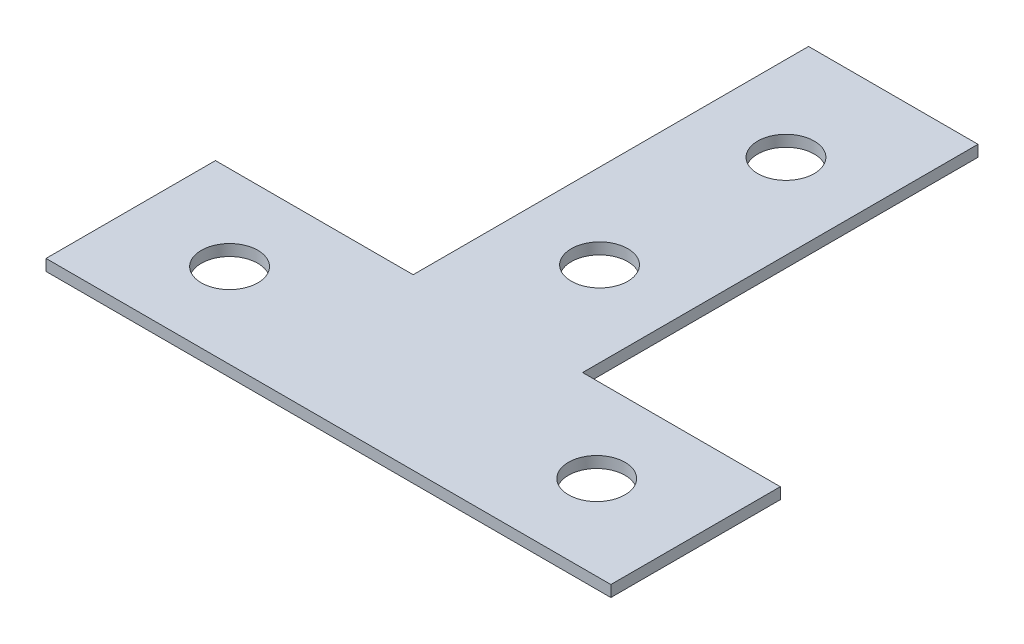
ISO-10303-21;
HEADER;
FILE_DESCRIPTION(('STEP AP214'),'2;1');
FILE_NAME('part.step','',(''),(''),'','','');
FILE_SCHEMA(('AUTOMOTIVE_DESIGN { 1 0 10303 214 1 1 1 1 }'));
ENDSEC;
DATA;
#1=APPLICATION_CONTEXT('core data for automotive mechanical design processes');
#2=APPLICATION_PROTOCOL_DEFINITION('international standard','automotive_design',2000,#1);
#3=PRODUCT_CONTEXT('',#1,'mechanical');
#4=PRODUCT('Part','Part','',(#3));
#5=PRODUCT_RELATED_PRODUCT_CATEGORY('part','',(#4));
#6=PRODUCT_DEFINITION_FORMATION('','',#4);
#7=PRODUCT_DEFINITION_CONTEXT('part definition',#1,'design');
#8=PRODUCT_DEFINITION('design','',#6,#7);
#9=PRODUCT_DEFINITION_SHAPE('','',#8);
#10=(LENGTH_UNIT() NAMED_UNIT(*) SI_UNIT(.MILLI.,.METRE.));
#11=(NAMED_UNIT(*) PLANE_ANGLE_UNIT() SI_UNIT($,.RADIAN.));
#12=(NAMED_UNIT(*) SI_UNIT($,.STERADIAN.) SOLID_ANGLE_UNIT());
#13=UNCERTAINTY_MEASURE_WITH_UNIT(LENGTH_MEASURE(1.E-05),#10,'distance_accuracy_value','');
#14=(GEOMETRIC_REPRESENTATION_CONTEXT(3) GLOBAL_UNCERTAINTY_ASSIGNED_CONTEXT((#13)) GLOBAL_UNIT_ASSIGNED_CONTEXT((#10,
#11,#12)) REPRESENTATION_CONTEXT('',''));
#15=CARTESIAN_POINT('',(0.,0.,0.));
#16=DIRECTION('',(0.,0.,1.));
#17=DIRECTION('',(1.,0.,0.));
#18=AXIS2_PLACEMENT_3D('',#15,#16,#17);
#19=CARTESIAN_POINT('',(32.5,1.,-15.));
#20=DIRECTION('',(0.,0.,1.));
#21=DIRECTION('',(1.,0.,0.));
#22=AXIS2_PLACEMENT_3D('',#19,#20,#21);
#23=PLANE('',#22);
#24=DIRECTION('',(-1.,0.,0.));
#25=VECTOR('',#24,1.);
#26=CARTESIAN_POINT('',(32.5,0.,-15.));
#27=LINE('',#26,#25);
#28=CARTESIAN_POINT('',(50.,0.,-15.));
#29=VERTEX_POINT('',#28);
#30=CARTESIAN_POINT('',(32.5,0.,-15.));
#31=VERTEX_POINT('',#30);
#32=EDGE_CURVE('E140',#29,#31,#27,.T.);
#33=ORIENTED_EDGE('',*,*,#32,.T.);
#34=DIRECTION('',(0.,-1.,0.));
#35=VECTOR('',#34,1.);
#36=CARTESIAN_POINT('',(32.5,1.,-15.));
#37=LINE('',#36,#35);
#38=CARTESIAN_POINT('',(32.5,1.,-15.));
#39=VERTEX_POINT('',#38);
#40=EDGE_CURVE('E11',#39,#31,#37,.T.);
#41=ORIENTED_EDGE('',*,*,#40,.F.);
#42=DIRECTION('',(-1.,0.,0.));
#43=VECTOR('',#42,1.);
#44=CARTESIAN_POINT('',(32.5,1.,-15.));
#45=LINE('',#44,#43);
#46=CARTESIAN_POINT('',(50.,1.,-15.));
#47=VERTEX_POINT('',#46);
#48=EDGE_CURVE('E163',#47,#39,#45,.T.);
#49=ORIENTED_EDGE('',*,*,#48,.F.);
#50=DIRECTION('',(0.,-1.,0.));
#51=VECTOR('',#50,1.);
#52=CARTESIAN_POINT('',(50.,1.,-15.));
#53=LINE('',#52,#51);
#54=EDGE_CURVE('E136',#47,#29,#53,.T.);
#55=ORIENTED_EDGE('',*,*,#54,.T.);
#56=EDGE_LOOP('',(#33,#41,#49,#55));
#57=FACE_BOUND('',#56,.T.);
#58=ADVANCED_FACE('F39',(#57),#23,.F.);
#59=CARTESIAN_POINT('',(32.5,1.,-50.));
#60=DIRECTION('',(-1.,0.,0.));
#61=DIRECTION('',(0.,0.,1.));
#62=AXIS2_PLACEMENT_3D('',#59,#60,#61);
#63=PLANE('',#62);
#64=DIRECTION('',(0.,0.,-1.));
#65=VECTOR('',#64,1.);
#66=CARTESIAN_POINT('',(32.5,0.,-50.));
#67=LINE('',#66,#65);
#68=CARTESIAN_POINT('',(32.5,0.,-50.));
#69=VERTEX_POINT('',#68);
#70=EDGE_CURVE('E144',#31,#69,#67,.T.);
#71=ORIENTED_EDGE('',*,*,#70,.T.);
#72=DIRECTION('',(0.,-1.,0.));
#73=VECTOR('',#72,1.);
#74=CARTESIAN_POINT('',(32.5,1.,-50.));
#75=LINE('',#74,#73);
#76=CARTESIAN_POINT('',(32.5,1.,-50.));
#77=VERTEX_POINT('',#76);
#78=EDGE_CURVE('E48',#77,#69,#75,.T.);
#79=ORIENTED_EDGE('',*,*,#78,.F.);
#80=DIRECTION('',(0.,0.,-1.));
#81=VECTOR('',#80,1.);
#82=CARTESIAN_POINT('',(32.5,1.,-50.));
#83=LINE('',#82,#81);
#84=EDGE_CURVE('E99',#39,#77,#83,.T.);
#85=ORIENTED_EDGE('',*,*,#84,.F.);
#86=ORIENTED_EDGE('',*,*,#40,.T.);
#87=EDGE_LOOP('',(#71,#79,#85,#86));
#88=FACE_BOUND('',#87,.T.);
#89=ADVANCED_FACE('F272',(#88),#63,.F.);
#90=CARTESIAN_POINT('',(17.5,1.,-50.));
#91=DIRECTION('',(0.,0.,1.));
#92=DIRECTION('',(1.,0.,0.));
#93=AXIS2_PLACEMENT_3D('',#90,#91,#92);
#94=PLANE('',#93);
#95=DIRECTION('',(-1.,0.,0.));
#96=VECTOR('',#95,1.);
#97=CARTESIAN_POINT('',(17.5,0.,-50.));
#98=LINE('',#97,#96);
#99=CARTESIAN_POINT('',(17.5,0.,-50.));
#100=VERTEX_POINT('',#99);
#101=EDGE_CURVE('E148',#69,#100,#98,.T.);
#102=ORIENTED_EDGE('',*,*,#101,.T.);
#103=DIRECTION('',(0.,-1.,0.));
#104=VECTOR('',#103,1.);
#105=CARTESIAN_POINT('',(17.5,1.,-50.));
#106=LINE('',#105,#104);
#107=CARTESIAN_POINT('',(17.5,1.,-50.));
#108=VERTEX_POINT('',#107);
#109=EDGE_CURVE('E174',#108,#100,#106,.T.);
#110=ORIENTED_EDGE('',*,*,#109,.F.);
#111=DIRECTION('',(-1.,0.,0.));
#112=VECTOR('',#111,1.);
#113=CARTESIAN_POINT('',(17.5,1.,-50.));
#114=LINE('',#113,#112);
#115=EDGE_CURVE('E184',#77,#108,#114,.T.);
#116=ORIENTED_EDGE('',*,*,#115,.F.);
#117=ORIENTED_EDGE('',*,*,#78,.T.);
#118=EDGE_LOOP('',(#102,#110,#116,#117));
#119=FACE_BOUND('',#118,.T.);
#120=ADVANCED_FACE('F182',(#119),#94,.F.);
#121=CARTESIAN_POINT('',(17.5,1.,-50.));
#122=DIRECTION('',(1.,0.,0.));
#123=DIRECTION('',(0.,0.,-1.));
#124=AXIS2_PLACEMENT_3D('',#121,#122,#123);
#125=PLANE('',#124);
#126=DIRECTION('',(0.,0.,1.));
#127=VECTOR('',#126,1.);
#128=CARTESIAN_POINT('',(17.5,0.,-50.));
#129=LINE('',#128,#127);
#130=CARTESIAN_POINT('',(17.5,0.,-15.));
#131=VERTEX_POINT('',#130);
#132=EDGE_CURVE('E151',#100,#131,#129,.T.);
#133=ORIENTED_EDGE('',*,*,#132,.T.);
#134=DIRECTION('',(0.,-1.,0.));
#135=VECTOR('',#134,1.);
#136=CARTESIAN_POINT('',(17.5,1.,-15.));
#137=LINE('',#136,#135);
#138=CARTESIAN_POINT('',(17.5,1.,-15.));
#139=VERTEX_POINT('',#138);
#140=EDGE_CURVE('E170',#139,#131,#137,.T.);
#141=ORIENTED_EDGE('',*,*,#140,.F.);
#142=DIRECTION('',(0.,0.,1.));
#143=VECTOR('',#142,1.);
#144=CARTESIAN_POINT('',(17.5,1.,-50.));
#145=LINE('',#144,#143);
#146=EDGE_CURVE('E197',#108,#139,#145,.T.);
#147=ORIENTED_EDGE('',*,*,#146,.F.);
#148=ORIENTED_EDGE('',*,*,#109,.T.);
#149=EDGE_LOOP('',(#133,#141,#147,#148));
#150=FACE_BOUND('',#149,.T.);
#151=ADVANCED_FACE('F192',(#150),#125,.F.);
#152=CARTESIAN_POINT('',(17.5,1.,-15.));
#153=DIRECTION('',(0.,0.,1.));
#154=DIRECTION('',(1.,0.,0.));
#155=AXIS2_PLACEMENT_3D('',#152,#153,#154);
#156=PLANE('',#155);
#157=DIRECTION('',(-1.,0.,0.));
#158=VECTOR('',#157,1.);
#159=CARTESIAN_POINT('',(17.5,0.,-15.));
#160=LINE('',#159,#158);
#161=CARTESIAN_POINT('',(0.,0.,-15.));
#162=VERTEX_POINT('',#161);
#163=EDGE_CURVE('E154',#131,#162,#160,.T.);
#164=ORIENTED_EDGE('',*,*,#163,.T.);
#165=DIRECTION('',(0.,-1.,0.));
#166=VECTOR('',#165,1.);
#167=CARTESIAN_POINT('',(0.,1.,-15.));
#168=LINE('',#167,#166);
#169=CARTESIAN_POINT('',(0.,1.,-15.));
#170=VERTEX_POINT('',#169);
#171=EDGE_CURVE('E129',#170,#162,#168,.T.);
#172=ORIENTED_EDGE('',*,*,#171,.F.);
#173=DIRECTION('',(-1.,0.,0.));
#174=VECTOR('',#173,1.);
#175=CARTESIAN_POINT('',(17.5,1.,-15.));
#176=LINE('',#175,#174);
#177=EDGE_CURVE('E118',#139,#170,#176,.T.);
#178=ORIENTED_EDGE('',*,*,#177,.F.);
#179=ORIENTED_EDGE('',*,*,#140,.T.);
#180=EDGE_LOOP('',(#164,#172,#178,#179));
#181=FACE_BOUND('',#180,.T.);
#182=ADVANCED_FACE('F195',(#181),#156,.F.);
#183=CARTESIAN_POINT('',(0.,1.,-15.));
#184=DIRECTION('',(1.,0.,0.));
#185=DIRECTION('',(0.,0.,-1.));
#186=AXIS2_PLACEMENT_3D('',#183,#184,#185);
#187=PLANE('',#186);
#188=DIRECTION('',(0.,0.,1.));
#189=VECTOR('',#188,1.);
#190=CARTESIAN_POINT('',(0.,0.,-15.));
#191=LINE('',#190,#189);
#192=CARTESIAN_POINT('',(0.,0.,0.));
#193=VERTEX_POINT('',#192);
#194=EDGE_CURVE('E127',#162,#193,#191,.T.);
#195=ORIENTED_EDGE('',*,*,#194,.T.);
#196=DIRECTION('',(0.,-1.,0.));
#197=VECTOR('',#196,1.);
#198=CARTESIAN_POINT('',(0.,1.,0.));
#199=LINE('',#198,#197);
#200=CARTESIAN_POINT('',(0.,1.,0.));
#201=VERTEX_POINT('',#200);
#202=EDGE_CURVE('E124',#201,#193,#199,.T.);
#203=ORIENTED_EDGE('',*,*,#202,.F.);
#204=DIRECTION('',(0.,0.,1.));
#205=VECTOR('',#204,1.);
#206=CARTESIAN_POINT('',(0.,1.,-15.));
#207=LINE('',#206,#205);
#208=EDGE_CURVE('E112',#170,#201,#207,.T.);
#209=ORIENTED_EDGE('',*,*,#208,.F.);
#210=ORIENTED_EDGE('',*,*,#171,.T.);
#211=EDGE_LOOP('',(#195,#203,#209,#210));
#212=FACE_BOUND('',#211,.T.);
#213=ADVANCED_FACE('F125',(#212),#187,.F.);
#214=CARTESIAN_POINT('',(50.,1.,0.));
#215=DIRECTION('',(0.,0.,-1.));
#216=DIRECTION('',(-1.,0.,0.));
#217=AXIS2_PLACEMENT_3D('',#214,#215,#216);
#218=PLANE('',#217);
#219=DIRECTION('',(1.,0.,0.));
#220=VECTOR('',#219,1.);
#221=CARTESIAN_POINT('',(50.,0.,0.));
#222=LINE('',#221,#220);
#223=CARTESIAN_POINT('',(50.,0.,0.));
#224=VERTEX_POINT('',#223);
#225=EDGE_CURVE('E85',#193,#224,#222,.T.);
#226=ORIENTED_EDGE('',*,*,#225,.T.);
#227=DIRECTION('',(0.,-1.,0.));
#228=VECTOR('',#227,1.);
#229=CARTESIAN_POINT('',(50.,1.,0.));
#230=LINE('',#229,#228);
#231=CARTESIAN_POINT('',(50.,1.,0.));
#232=VERTEX_POINT('',#231);
#233=EDGE_CURVE('E130',#232,#224,#230,.T.);
#234=ORIENTED_EDGE('',*,*,#233,.F.);
#235=DIRECTION('',(1.,0.,0.));
#236=VECTOR('',#235,1.);
#237=CARTESIAN_POINT('',(50.,1.,0.));
#238=LINE('',#237,#236);
#239=EDGE_CURVE('E116',#201,#232,#238,.T.);
#240=ORIENTED_EDGE('',*,*,#239,.F.);
#241=ORIENTED_EDGE('',*,*,#202,.T.);
#242=EDGE_LOOP('',(#226,#234,#240,#241));
#243=FACE_BOUND('',#242,.T.);
#244=ADVANCED_FACE('F132',(#243),#218,.F.);
#245=CARTESIAN_POINT('',(50.,1.,-15.));
#246=DIRECTION('',(-1.,0.,0.));
#247=DIRECTION('',(0.,0.,1.));
#248=AXIS2_PLACEMENT_3D('',#245,#246,#247);
#249=PLANE('',#248);
#250=DIRECTION('',(0.,0.,-1.));
#251=VECTOR('',#250,1.);
#252=CARTESIAN_POINT('',(50.,0.,-15.));
#253=LINE('',#252,#251);
#254=EDGE_CURVE('E91',#224,#29,#253,.T.);
#255=ORIENTED_EDGE('',*,*,#254,.T.);
#256=ORIENTED_EDGE('',*,*,#54,.F.);
#257=DIRECTION('',(0.,0.,-1.));
#258=VECTOR('',#257,1.);
#259=CARTESIAN_POINT('',(50.,1.,-15.));
#260=LINE('',#259,#258);
#261=EDGE_CURVE('E56',#232,#47,#260,.T.);
#262=ORIENTED_EDGE('',*,*,#261,.F.);
#263=ORIENTED_EDGE('',*,*,#233,.T.);
#264=EDGE_LOOP('',(#255,#256,#262,#263));
#265=FACE_BOUND('',#264,.T.);
#266=ADVANCED_FACE('F250',(#265),#249,.F.);
#267=CARTESIAN_POINT('',(0.,1.,0.));
#268=DIRECTION('',(0.,-1.,0.));
#269=DIRECTION('',(0.,0.,-1.));
#270=AXIS2_PLACEMENT_3D('',#267,#268,#269);
#271=PLANE('',#270);
#272=CARTESIAN_POINT('',(41.25,1.,-7.5));
#273=DIRECTION('',(0.,-1.,0.));
#274=DIRECTION('',(0.,0.,-1.));
#275=AXIS2_PLACEMENT_3D('',#272,#273,#274);
#276=CIRCLE('',#275,2.5);
#277=CARTESIAN_POINT('',(41.25,1.,-10.));
#278=VERTEX_POINT('',#277);
#279=EDGE_CURVE('E145',#278,#278,#276,.T.);
#280=ORIENTED_EDGE('',*,*,#279,.T.);
#281=EDGE_LOOP('',(#280));
#282=FACE_BOUND('',#281,.T.);
#283=CARTESIAN_POINT('',(25.,1.,-40.5));
#284=DIRECTION('',(0.,-1.,0.));
#285=DIRECTION('',(0.,0.,-1.));
#286=AXIS2_PLACEMENT_3D('',#283,#284,#285);
#287=CIRCLE('',#286,2.5);
#288=CARTESIAN_POINT('',(25.,1.,-43.));
#289=VERTEX_POINT('',#288);
#290=EDGE_CURVE('E210',#289,#289,#287,.T.);
#291=ORIENTED_EDGE('',*,*,#290,.T.);
#292=EDGE_LOOP('',(#291));
#293=FACE_BOUND('',#292,.T.);
#294=CARTESIAN_POINT('',(25.,1.,-24.));
#295=DIRECTION('',(0.,-1.,0.));
#296=DIRECTION('',(0.,0.,-1.));
#297=AXIS2_PLACEMENT_3D('',#294,#295,#296);
#298=CIRCLE('',#297,2.5);
#299=CARTESIAN_POINT('',(25.,1.,-26.5));
#300=VERTEX_POINT('',#299);
#301=EDGE_CURVE('E214',#300,#300,#298,.T.);
#302=ORIENTED_EDGE('',*,*,#301,.T.);
#303=EDGE_LOOP('',(#302));
#304=FACE_BOUND('',#303,.T.);
#305=CARTESIAN_POINT('',(8.75,1.,-7.5));
#306=DIRECTION('',(0.,-1.,0.));
#307=DIRECTION('',(0.,0.,-1.));
#308=AXIS2_PLACEMENT_3D('',#305,#306,#307);
#309=CIRCLE('',#308,2.5);
#310=CARTESIAN_POINT('',(8.75,1.,-10.));
#311=VERTEX_POINT('',#310);
#312=EDGE_CURVE('E218',#311,#311,#309,.T.);
#313=ORIENTED_EDGE('',*,*,#312,.T.);
#314=EDGE_LOOP('',(#313));
#315=FACE_BOUND('',#314,.T.);
#316=ORIENTED_EDGE('',*,*,#48,.T.);
#317=ORIENTED_EDGE('',*,*,#84,.T.);
#318=ORIENTED_EDGE('',*,*,#115,.T.);
#319=ORIENTED_EDGE('',*,*,#146,.T.);
#320=ORIENTED_EDGE('',*,*,#177,.T.);
#321=ORIENTED_EDGE('',*,*,#208,.T.);
#322=ORIENTED_EDGE('',*,*,#239,.T.);
#323=ORIENTED_EDGE('',*,*,#261,.T.);
#324=EDGE_LOOP('',(#316,#317,#318,#319,#320,#321,#322,#323));
#325=FACE_BOUND('',#324,.T.);
#326=ADVANCED_FACE('F114',(#282,#293,#304,#315,#325),#271,.F.);
#327=CARTESIAN_POINT('',(0.,0.,0.));
#328=DIRECTION('',(0.,-1.,0.));
#329=DIRECTION('',(0.,0.,-1.));
#330=AXIS2_PLACEMENT_3D('',#327,#328,#329);
#331=PLANE('',#330);
#332=CARTESIAN_POINT('',(41.25,0.,-7.5));
#333=DIRECTION('',(0.,1.,0.));
#334=DIRECTION('',(0.,0.,1.));
#335=AXIS2_PLACEMENT_3D('',#332,#333,#334);
#336=CIRCLE('',#335,2.5);
#337=CARTESIAN_POINT('',(41.25,0.,-5.));
#338=VERTEX_POINT('',#337);
#339=EDGE_CURVE('E222',#338,#338,#336,.T.);
#340=ORIENTED_EDGE('',*,*,#339,.T.);
#341=EDGE_LOOP('',(#340));
#342=FACE_BOUND('',#341,.T.);
#343=CARTESIAN_POINT('',(25.,0.,-40.5));
#344=DIRECTION('',(0.,1.,0.));
#345=DIRECTION('',(0.,0.,1.));
#346=AXIS2_PLACEMENT_3D('',#343,#344,#345);
#347=CIRCLE('',#346,2.5);
#348=CARTESIAN_POINT('',(25.,0.,-38.));
#349=VERTEX_POINT('',#348);
#350=EDGE_CURVE('E231',#349,#349,#347,.T.);
#351=ORIENTED_EDGE('',*,*,#350,.T.);
#352=EDGE_LOOP('',(#351));
#353=FACE_BOUND('',#352,.T.);
#354=CARTESIAN_POINT('',(25.,0.,-24.));
#355=DIRECTION('',(0.,1.,0.));
#356=DIRECTION('',(0.,0.,1.));
#357=AXIS2_PLACEMENT_3D('',#354,#355,#356);
#358=CIRCLE('',#357,2.5);
#359=CARTESIAN_POINT('',(25.,0.,-21.5));
#360=VERTEX_POINT('',#359);
#361=EDGE_CURVE('E227',#360,#360,#358,.T.);
#362=ORIENTED_EDGE('',*,*,#361,.T.);
#363=EDGE_LOOP('',(#362));
#364=FACE_BOUND('',#363,.T.);
#365=CARTESIAN_POINT('',(8.75,0.,-7.5));
#366=DIRECTION('',(0.,1.,0.));
#367=DIRECTION('',(0.,0.,1.));
#368=AXIS2_PLACEMENT_3D('',#365,#366,#367);
#369=CIRCLE('',#368,2.5);
#370=CARTESIAN_POINT('',(8.75,0.,-5.));
#371=VERTEX_POINT('',#370);
#372=EDGE_CURVE('E223',#371,#371,#369,.T.);
#373=ORIENTED_EDGE('',*,*,#372,.T.);
#374=EDGE_LOOP('',(#373));
#375=FACE_BOUND('',#374,.T.);
#376=ORIENTED_EDGE('',*,*,#32,.F.);
#377=ORIENTED_EDGE('',*,*,#254,.F.);
#378=ORIENTED_EDGE('',*,*,#225,.F.);
#379=ORIENTED_EDGE('',*,*,#194,.F.);
#380=ORIENTED_EDGE('',*,*,#163,.F.);
#381=ORIENTED_EDGE('',*,*,#132,.F.);
#382=ORIENTED_EDGE('',*,*,#101,.F.);
#383=ORIENTED_EDGE('',*,*,#70,.F.);
#384=EDGE_LOOP('',(#376,#377,#378,#379,#380,#381,#382,#383));
#385=FACE_BOUND('',#384,.T.);
#386=ADVANCED_FACE('F188',(#342,#353,#364,#375,#385),#331,.T.);
#387=CARTESIAN_POINT('',(8.75,0.,-7.5));
#388=DIRECTION('',(0.,1.,0.));
#389=DIRECTION('',(0.,0.,1.));
#390=AXIS2_PLACEMENT_3D('',#387,#388,#389);
#391=CYLINDRICAL_SURFACE('',#390,2.5);
#392=ORIENTED_EDGE('',*,*,#372,.F.);
#393=EDGE_LOOP('',(#392));
#394=FACE_BOUND('',#393,.T.);
#395=ORIENTED_EDGE('',*,*,#312,.F.);
#396=EDGE_LOOP('',(#395));
#397=FACE_BOUND('',#396,.T.);
#398=ADVANCED_FACE('F258',(#394,#397),#391,.F.);
#399=CARTESIAN_POINT('',(25.,0.,-24.));
#400=DIRECTION('',(0.,1.,0.));
#401=DIRECTION('',(0.,0.,1.));
#402=AXIS2_PLACEMENT_3D('',#399,#400,#401);
#403=CYLINDRICAL_SURFACE('',#402,2.5);
#404=ORIENTED_EDGE('',*,*,#361,.F.);
#405=EDGE_LOOP('',(#404));
#406=FACE_BOUND('',#405,.T.);
#407=ORIENTED_EDGE('',*,*,#301,.F.);
#408=EDGE_LOOP('',(#407));
#409=FACE_BOUND('',#408,.T.);
#410=ADVANCED_FACE('F260',(#406,#409),#403,.F.);
#411=CARTESIAN_POINT('',(25.,0.,-40.5));
#412=DIRECTION('',(0.,1.,0.));
#413=DIRECTION('',(0.,0.,1.));
#414=AXIS2_PLACEMENT_3D('',#411,#412,#413);
#415=CYLINDRICAL_SURFACE('',#414,2.5);
#416=ORIENTED_EDGE('',*,*,#350,.F.);
#417=EDGE_LOOP('',(#416));
#418=FACE_BOUND('',#417,.T.);
#419=ORIENTED_EDGE('',*,*,#290,.F.);
#420=EDGE_LOOP('',(#419));
#421=FACE_BOUND('',#420,.T.);
#422=ADVANCED_FACE('F244',(#418,#421),#415,.F.);
#423=CARTESIAN_POINT('',(41.25,0.,-7.5));
#424=DIRECTION('',(0.,1.,0.));
#425=DIRECTION('',(0.,0.,1.));
#426=AXIS2_PLACEMENT_3D('',#423,#424,#425);
#427=CYLINDRICAL_SURFACE('',#426,2.5);
#428=ORIENTED_EDGE('',*,*,#339,.F.);
#429=EDGE_LOOP('',(#428));
#430=FACE_BOUND('',#429,.T.);
#431=ORIENTED_EDGE('',*,*,#279,.F.);
#432=EDGE_LOOP('',(#431));
#433=FACE_BOUND('',#432,.T.);
#434=ADVANCED_FACE('F241',(#430,#433),#427,.F.);
#435=CLOSED_SHELL('',(#58,#89,#120,#151,#182,#213,#244,#266,#326,#386,#398,#410,#422,#434));
#436=MANIFOLD_SOLID_BREP('B2',#435);
#437=ADVANCED_BREP_SHAPE_REPRESENTATION('',(#18,#436),#14);
#438=SHAPE_DEFINITION_REPRESENTATION(#9,#437);
ENDSEC;
END-ISO-10303-21;
